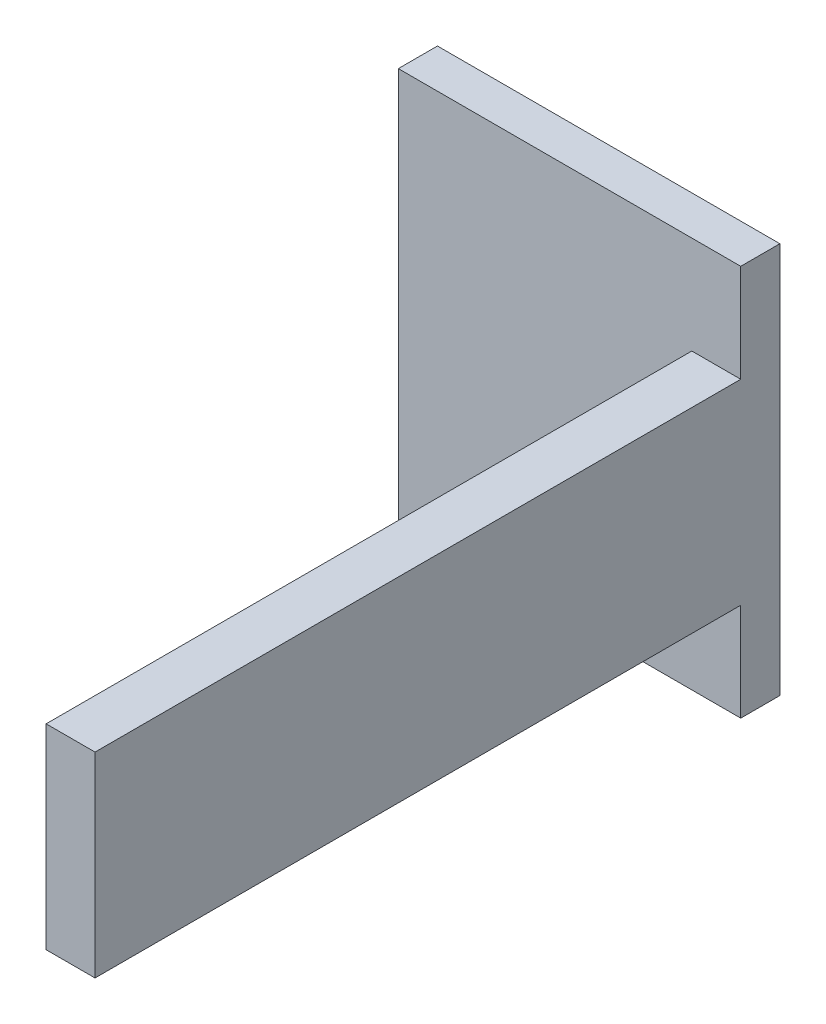
ISO-10303-21;
HEADER;
FILE_DESCRIPTION(('STEP AP214'),'2;1');
FILE_NAME('part.step','',(''),(''),'','','');
FILE_SCHEMA(('AUTOMOTIVE_DESIGN { 1 0 10303 214 1 1 1 1 }'));
ENDSEC;
DATA;
#1=APPLICATION_CONTEXT('core data for automotive mechanical design processes');
#2=APPLICATION_PROTOCOL_DEFINITION('international standard','automotive_design',2000,#1);
#3=PRODUCT_CONTEXT('',#1,'mechanical');
#4=PRODUCT('Part','Part','',(#3));
#5=PRODUCT_RELATED_PRODUCT_CATEGORY('part','',(#4));
#6=PRODUCT_DEFINITION_FORMATION('','',#4);
#7=PRODUCT_DEFINITION_CONTEXT('part definition',#1,'design');
#8=PRODUCT_DEFINITION('design','',#6,#7);
#9=PRODUCT_DEFINITION_SHAPE('','',#8);
#10=(LENGTH_UNIT() NAMED_UNIT(*) SI_UNIT(.MILLI.,.METRE.));
#11=(NAMED_UNIT(*) PLANE_ANGLE_UNIT() SI_UNIT($,.RADIAN.));
#12=(NAMED_UNIT(*) SI_UNIT($,.STERADIAN.) SOLID_ANGLE_UNIT());
#13=UNCERTAINTY_MEASURE_WITH_UNIT(LENGTH_MEASURE(1.E-05),#10,'distance_accuracy_value','');
#14=(GEOMETRIC_REPRESENTATION_CONTEXT(3) GLOBAL_UNCERTAINTY_ASSIGNED_CONTEXT((#13)) GLOBAL_UNIT_ASSIGNED_CONTEXT((#10,
#11,#12)) REPRESENTATION_CONTEXT('',''));
#15=CARTESIAN_POINT('',(0.,0.,0.));
#16=DIRECTION('',(0.,0.,1.));
#17=DIRECTION('',(1.,0.,0.));
#18=AXIS2_PLACEMENT_3D('',#15,#16,#17);
#19=CARTESIAN_POINT('',(425.,40.,70.));
#20=DIRECTION('',(0.,0.,1.));
#21=DIRECTION('',(1.,0.,0.));
#22=AXIS2_PLACEMENT_3D('',#19,#20,#21);
#23=PLANE('',#22);
#24=DIRECTION('',(0.,1.,0.));
#25=VECTOR('',#24,1.);
#26=CARTESIAN_POINT('',(425.,40.,70.));
#27=LINE('',#26,#25);
#28=CARTESIAN_POINT('',(425.,40.,70.));
#29=VERTEX_POINT('',#28);
#30=CARTESIAN_POINT('',(425.,60.,70.));
#31=VERTEX_POINT('',#30);
#32=EDGE_CURVE('E105',#29,#31,#27,.T.);
#33=ORIENTED_EDGE('',*,*,#32,.F.);
#34=DIRECTION('',(1.,0.,0.));
#35=VECTOR('',#34,1.);
#36=CARTESIAN_POINT('',(425.,40.,70.));
#37=LINE('',#36,#35);
#38=CARTESIAN_POINT('',(430.,40.,70.));
#39=VERTEX_POINT('',#38);
#40=EDGE_CURVE('E9',#29,#39,#37,.T.);
#41=ORIENTED_EDGE('',*,*,#40,.T.);
#42=DIRECTION('',(0.,1.,0.));
#43=VECTOR('',#42,1.);
#44=CARTESIAN_POINT('',(430.,40.,70.));
#45=LINE('',#44,#43);
#46=CARTESIAN_POINT('',(430.,60.,70.));
#47=VERTEX_POINT('',#46);
#48=EDGE_CURVE('E99',#39,#47,#45,.T.);
#49=ORIENTED_EDGE('',*,*,#48,.T.);
#50=DIRECTION('',(1.,0.,0.));
#51=VECTOR('',#50,1.);
#52=CARTESIAN_POINT('',(425.,60.,70.));
#53=LINE('',#52,#51);
#54=EDGE_CURVE('E91',#31,#47,#53,.T.);
#55=ORIENTED_EDGE('',*,*,#54,.F.);
#56=EDGE_LOOP('',(#33,#41,#49,#55));
#57=FACE_BOUND('',#56,.T.);
#58=ADVANCED_FACE('F15',(#57),#23,.T.);
#59=CARTESIAN_POINT('',(425.,40.,4.));
#60=DIRECTION('',(0.,1.,0.));
#61=DIRECTION('',(1.,0.,0.));
#62=AXIS2_PLACEMENT_3D('',#59,#60,#61);
#63=PLANE('',#62);
#64=DIRECTION('',(0.,0.,1.));
#65=VECTOR('',#64,1.);
#66=CARTESIAN_POINT('',(430.,40.,4.));
#67=LINE('',#66,#65);
#68=CARTESIAN_POINT('',(430.,40.,4.));
#69=VERTEX_POINT('',#68);
#70=EDGE_CURVE('E102',#69,#39,#67,.T.);
#71=ORIENTED_EDGE('',*,*,#70,.T.);
#72=ORIENTED_EDGE('',*,*,#40,.F.);
#73=DIRECTION('',(0.,0.,1.));
#74=VECTOR('',#73,1.);
#75=CARTESIAN_POINT('',(425.,40.,4.));
#76=LINE('',#75,#74);
#77=CARTESIAN_POINT('',(425.,40.,4.));
#78=VERTEX_POINT('',#77);
#79=EDGE_CURVE('E25',#78,#29,#76,.T.);
#80=ORIENTED_EDGE('',*,*,#79,.F.);
#81=DIRECTION('',(1.,0.,0.));
#82=VECTOR('',#81,1.);
#83=CARTESIAN_POINT('',(425.,40.,4.));
#84=LINE('',#83,#82);
#85=EDGE_CURVE('E106',#78,#69,#84,.T.);
#86=ORIENTED_EDGE('',*,*,#85,.T.);
#87=EDGE_LOOP('',(#71,#72,#80,#86));
#88=FACE_BOUND('',#87,.T.);
#89=ADVANCED_FACE('F17',(#88),#63,.F.);
#90=CARTESIAN_POINT('',(425.,40.,4.));
#91=DIRECTION('',(1.,0.,0.));
#92=DIRECTION('',(0.,1.,0.));
#93=AXIS2_PLACEMENT_3D('',#90,#91,#92);
#94=PLANE('',#93);
#95=ORIENTED_EDGE('',*,*,#32,.T.);
#96=DIRECTION('',(0.,0.,1.));
#97=VECTOR('',#96,1.);
#98=CARTESIAN_POINT('',(425.,60.,4.));
#99=LINE('',#98,#97);
#100=CARTESIAN_POINT('',(425.,60.,4.));
#101=VERTEX_POINT('',#100);
#102=EDGE_CURVE('E109',#101,#31,#99,.T.);
#103=ORIENTED_EDGE('',*,*,#102,.F.);
#104=DIRECTION('',(0.,1.,0.));
#105=VECTOR('',#104,1.);
#106=CARTESIAN_POINT('',(425.,40.,4.));
#107=LINE('',#106,#105);
#108=EDGE_CURVE('E134',#78,#101,#107,.T.);
#109=ORIENTED_EDGE('',*,*,#108,.F.);
#110=ORIENTED_EDGE('',*,*,#79,.T.);
#111=EDGE_LOOP('',(#95,#103,#109,#110));
#112=FACE_BOUND('',#111,.T.);
#113=ADVANCED_FACE('F132',(#112),#94,.F.);
#114=CARTESIAN_POINT('',(425.,60.,4.));
#115=DIRECTION('',(0.,1.,0.));
#116=DIRECTION('',(1.,0.,0.));
#117=AXIS2_PLACEMENT_3D('',#114,#115,#116);
#118=PLANE('',#117);
#119=DIRECTION('',(1.,0.,0.));
#120=VECTOR('',#119,1.);
#121=CARTESIAN_POINT('',(425.,60.,4.));
#122=LINE('',#121,#120);
#123=CARTESIAN_POINT('',(430.,60.,4.));
#124=VERTEX_POINT('',#123);
#125=EDGE_CURVE('E139',#101,#124,#122,.T.);
#126=ORIENTED_EDGE('',*,*,#125,.F.);
#127=ORIENTED_EDGE('',*,*,#102,.T.);
#128=ORIENTED_EDGE('',*,*,#54,.T.);
#129=DIRECTION('',(0.,0.,1.));
#130=VECTOR('',#129,1.);
#131=CARTESIAN_POINT('',(430.,60.,4.));
#132=LINE('',#131,#130);
#133=EDGE_CURVE('E113',#124,#47,#132,.T.);
#134=ORIENTED_EDGE('',*,*,#133,.F.);
#135=EDGE_LOOP('',(#126,#127,#128,#134));
#136=FACE_BOUND('',#135,.T.);
#137=ADVANCED_FACE('F235',(#136),#118,.T.);
#138=CARTESIAN_POINT('',(430.,30.,0.));
#139=DIRECTION('',(1.,0.,0.));
#140=DIRECTION('',(0.,1.,0.));
#141=AXIS2_PLACEMENT_3D('',#138,#139,#140);
#142=PLANE('',#141);
#143=DIRECTION('',(0.,0.,1.));
#144=VECTOR('',#143,1.);
#145=CARTESIAN_POINT('',(430.,30.,0.));
#146=LINE('',#145,#144);
#147=CARTESIAN_POINT('',(430.,30.,0.));
#148=VERTEX_POINT('',#147);
#149=CARTESIAN_POINT('',(430.,30.,4.));
#150=VERTEX_POINT('',#149);
#151=EDGE_CURVE('E174',#148,#150,#146,.T.);
#152=ORIENTED_EDGE('',*,*,#151,.F.);
#153=DIRECTION('',(0.,1.,0.));
#154=VECTOR('',#153,1.);
#155=CARTESIAN_POINT('',(430.,30.,0.));
#156=LINE('',#155,#154);
#157=CARTESIAN_POINT('',(430.,70.,0.));
#158=VERTEX_POINT('',#157);
#159=EDGE_CURVE('E120',#148,#158,#156,.T.);
#160=ORIENTED_EDGE('',*,*,#159,.T.);
#161=DIRECTION('',(0.,0.,1.));
#162=VECTOR('',#161,1.);
#163=CARTESIAN_POINT('',(430.,70.,0.));
#164=LINE('',#163,#162);
#165=CARTESIAN_POINT('',(430.,70.,4.));
#166=VERTEX_POINT('',#165);
#167=EDGE_CURVE('E153',#158,#166,#164,.T.);
#168=ORIENTED_EDGE('',*,*,#167,.T.);
#169=DIRECTION('',(0.,1.,0.));
#170=VECTOR('',#169,1.);
#171=CARTESIAN_POINT('',(430.,30.,4.));
#172=LINE('',#171,#170);
#173=EDGE_CURVE('E164',#124,#166,#172,.T.);
#174=ORIENTED_EDGE('',*,*,#173,.F.);
#175=ORIENTED_EDGE('',*,*,#133,.T.);
#176=ORIENTED_EDGE('',*,*,#48,.F.);
#177=ORIENTED_EDGE('',*,*,#70,.F.);
#178=DIRECTION('',(0.,1.,0.));
#179=VECTOR('',#178,1.);
#180=CARTESIAN_POINT('',(430.,30.,4.));
#181=LINE('',#180,#179);
#182=EDGE_CURVE('E145',#150,#69,#181,.T.);
#183=ORIENTED_EDGE('',*,*,#182,.F.);
#184=EDGE_LOOP('',(#152,#160,#168,#174,#175,#176,#177,#183));
#185=FACE_BOUND('',#184,.T.);
#186=ADVANCED_FACE('F114',(#185),#142,.T.);
#187=CARTESIAN_POINT('',(395.,30.,0.));
#188=DIRECTION('',(0.,0.,1.));
#189=DIRECTION('',(1.,0.,0.));
#190=AXIS2_PLACEMENT_3D('',#187,#188,#189);
#191=PLANE('',#190);
#192=DIRECTION('',(1.,0.,0.));
#193=VECTOR('',#192,1.);
#194=CARTESIAN_POINT('',(395.,70.,0.));
#195=LINE('',#194,#193);
#196=CARTESIAN_POINT('',(395.,70.,0.));
#197=VERTEX_POINT('',#196);
#198=EDGE_CURVE('E160',#197,#158,#195,.T.);
#199=ORIENTED_EDGE('',*,*,#198,.T.);
#200=ORIENTED_EDGE('',*,*,#159,.F.);
#201=DIRECTION('',(1.,0.,0.));
#202=VECTOR('',#201,1.);
#203=CARTESIAN_POINT('',(395.,30.,0.));
#204=LINE('',#203,#202);
#205=CARTESIAN_POINT('',(395.,30.,0.));
#206=VERTEX_POINT('',#205);
#207=EDGE_CURVE('E179',#206,#148,#204,.T.);
#208=ORIENTED_EDGE('',*,*,#207,.F.);
#209=DIRECTION('',(0.,1.,0.));
#210=VECTOR('',#209,1.);
#211=CARTESIAN_POINT('',(395.,30.,0.));
#212=LINE('',#211,#210);
#213=EDGE_CURVE('E166',#206,#197,#212,.T.);
#214=ORIENTED_EDGE('',*,*,#213,.T.);
#215=EDGE_LOOP('',(#199,#200,#208,#214));
#216=FACE_BOUND('',#215,.T.);
#217=ADVANCED_FACE('F208',(#216),#191,.F.);
#218=CARTESIAN_POINT('',(395.,70.,0.));
#219=DIRECTION('',(0.,1.,0.));
#220=DIRECTION('',(1.,0.,0.));
#221=AXIS2_PLACEMENT_3D('',#218,#219,#220);
#222=PLANE('',#221);
#223=ORIENTED_EDGE('',*,*,#198,.F.);
#224=DIRECTION('',(0.,0.,1.));
#225=VECTOR('',#224,1.);
#226=CARTESIAN_POINT('',(395.,70.,0.));
#227=LINE('',#226,#225);
#228=CARTESIAN_POINT('',(395.,70.,4.));
#229=VERTEX_POINT('',#228);
#230=EDGE_CURVE('E193',#197,#229,#227,.T.);
#231=ORIENTED_EDGE('',*,*,#230,.T.);
#232=DIRECTION('',(1.,0.,0.));
#233=VECTOR('',#232,1.);
#234=CARTESIAN_POINT('',(395.,70.,4.));
#235=LINE('',#234,#233);
#236=EDGE_CURVE('E147',#229,#166,#235,.T.);
#237=ORIENTED_EDGE('',*,*,#236,.T.);
#238=ORIENTED_EDGE('',*,*,#167,.F.);
#239=EDGE_LOOP('',(#223,#231,#237,#238));
#240=FACE_BOUND('',#239,.T.);
#241=ADVANCED_FACE('F191',(#240),#222,.T.);
#242=CARTESIAN_POINT('',(395.,30.,4.));
#243=DIRECTION('',(0.,0.,1.));
#244=DIRECTION('',(1.,0.,0.));
#245=AXIS2_PLACEMENT_3D('',#242,#243,#244);
#246=PLANE('',#245);
#247=ORIENTED_EDGE('',*,*,#236,.F.);
#248=DIRECTION('',(0.,1.,0.));
#249=VECTOR('',#248,1.);
#250=CARTESIAN_POINT('',(395.,30.,4.));
#251=LINE('',#250,#249);
#252=CARTESIAN_POINT('',(395.,30.,4.));
#253=VERTEX_POINT('',#252);
#254=EDGE_CURVE('E198',#253,#229,#251,.T.);
#255=ORIENTED_EDGE('',*,*,#254,.F.);
#256=DIRECTION('',(1.,0.,0.));
#257=VECTOR('',#256,1.);
#258=CARTESIAN_POINT('',(395.,30.,4.));
#259=LINE('',#258,#257);
#260=EDGE_CURVE('E178',#253,#150,#259,.T.);
#261=ORIENTED_EDGE('',*,*,#260,.T.);
#262=ORIENTED_EDGE('',*,*,#182,.T.);
#263=ORIENTED_EDGE('',*,*,#85,.F.);
#264=ORIENTED_EDGE('',*,*,#108,.T.);
#265=ORIENTED_EDGE('',*,*,#125,.T.);
#266=ORIENTED_EDGE('',*,*,#173,.T.);
#267=EDGE_LOOP('',(#247,#255,#261,#262,#263,#264,#265,#266));
#268=FACE_BOUND('',#267,.T.);
#269=ADVANCED_FACE('F142',(#268),#246,.T.);
#270=CARTESIAN_POINT('',(395.,30.,0.));
#271=DIRECTION('',(0.,1.,0.));
#272=DIRECTION('',(1.,0.,0.));
#273=AXIS2_PLACEMENT_3D('',#270,#271,#272);
#274=PLANE('',#273);
#275=ORIENTED_EDGE('',*,*,#151,.T.);
#276=ORIENTED_EDGE('',*,*,#260,.F.);
#277=DIRECTION('',(0.,0.,1.));
#278=VECTOR('',#277,1.);
#279=CARTESIAN_POINT('',(395.,30.,0.));
#280=LINE('',#279,#278);
#281=EDGE_CURVE('E171',#206,#253,#280,.T.);
#282=ORIENTED_EDGE('',*,*,#281,.F.);
#283=ORIENTED_EDGE('',*,*,#207,.T.);
#284=EDGE_LOOP('',(#275,#276,#282,#283));
#285=FACE_BOUND('',#284,.T.);
#286=ADVANCED_FACE('F212',(#285),#274,.F.);
#287=CARTESIAN_POINT('',(395.,30.,0.));
#288=DIRECTION('',(1.,0.,0.));
#289=DIRECTION('',(0.,1.,0.));
#290=AXIS2_PLACEMENT_3D('',#287,#288,#289);
#291=PLANE('',#290);
#292=ORIENTED_EDGE('',*,*,#254,.T.);
#293=ORIENTED_EDGE('',*,*,#230,.F.);
#294=ORIENTED_EDGE('',*,*,#213,.F.);
#295=ORIENTED_EDGE('',*,*,#281,.T.);
#296=EDGE_LOOP('',(#292,#293,#294,#295));
#297=FACE_BOUND('',#296,.T.);
#298=ADVANCED_FACE('F211',(#297),#291,.F.);
#299=CLOSED_SHELL('',(#58,#89,#113,#137,#186,#217,#241,#269,#286,#298));
#300=MANIFOLD_SOLID_BREP('B1',#299);
#301=ADVANCED_BREP_SHAPE_REPRESENTATION('',(#18,#300),#14);
#302=SHAPE_DEFINITION_REPRESENTATION(#9,#301);
ENDSEC;
END-ISO-10303-21;
